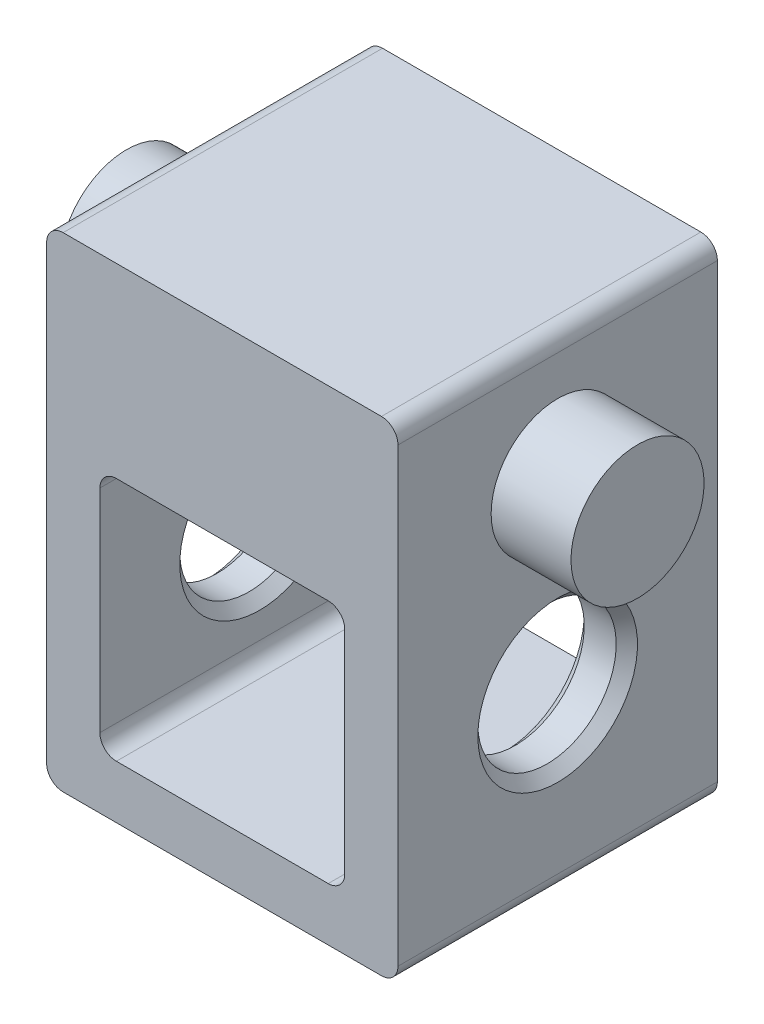
ISO-10303-21;
HEADER;
FILE_DESCRIPTION(('STEP AP214'),'2;1');
FILE_NAME('part.step','',(''),(''),'','','');
FILE_SCHEMA(('AUTOMOTIVE_DESIGN { 1 0 10303 214 1 1 1 1 }'));
ENDSEC;
DATA;
#1=APPLICATION_CONTEXT('core data for automotive mechanical design processes');
#2=APPLICATION_PROTOCOL_DEFINITION('international standard','automotive_design',2000,#1);
#3=PRODUCT_CONTEXT('',#1,'mechanical');
#4=PRODUCT('Part','Part','',(#3));
#5=PRODUCT_RELATED_PRODUCT_CATEGORY('part','',(#4));
#6=PRODUCT_DEFINITION_FORMATION('','',#4);
#7=PRODUCT_DEFINITION_CONTEXT('part definition',#1,'design');
#8=PRODUCT_DEFINITION('design','',#6,#7);
#9=PRODUCT_DEFINITION_SHAPE('','',#8);
#10=(LENGTH_UNIT() NAMED_UNIT(*) SI_UNIT(.MILLI.,.METRE.));
#11=(NAMED_UNIT(*) PLANE_ANGLE_UNIT() SI_UNIT($,.RADIAN.));
#12=(NAMED_UNIT(*) SI_UNIT($,.STERADIAN.) SOLID_ANGLE_UNIT());
#13=UNCERTAINTY_MEASURE_WITH_UNIT(LENGTH_MEASURE(1.E-05),#10,'distance_accuracy_value','');
#14=(GEOMETRIC_REPRESENTATION_CONTEXT(3) GLOBAL_UNCERTAINTY_ASSIGNED_CONTEXT((#13)) GLOBAL_UNIT_ASSIGNED_CONTEXT((#10,
#11,#12)) REPRESENTATION_CONTEXT('',''));
#15=CARTESIAN_POINT('',(0.,0.,0.));
#16=DIRECTION('',(0.,0.,1.));
#17=DIRECTION('',(1.,0.,0.));
#18=AXIS2_PLACEMENT_3D('',#15,#16,#17);
#19=CARTESIAN_POINT('',(-33.,23.,60.));
#20=DIRECTION('',(0.,-1.,0.));
#21=DIRECTION('',(0.,0.,-1.));
#22=AXIS2_PLACEMENT_3D('',#19,#20,#21);
#23=PLANE('',#22);
#24=DIRECTION('',(0.,0.,-1.));
#25=VECTOR('',#24,1.);
#26=CARTESIAN_POINT('',(-19.9,23.,0.));
#27=LINE('',#26,#25);
#28=CARTESIAN_POINT('',(-19.9,23.,60.));
#29=VERTEX_POINT('',#28);
#30=CARTESIAN_POINT('',(-19.9,23.,33.657597219348));
#31=VERTEX_POINT('',#30);
#32=EDGE_CURVE('E185',#29,#31,#27,.T.);
#33=ORIENTED_EDGE('',*,*,#32,.T.);
#34=DIRECTION('',(-1.,0.,0.));
#35=VECTOR('',#34,1.);
#36=CARTESIAN_POINT('',(98.3553390593274,23.,33.657597219348));
#37=LINE('',#36,#35);
#38=CARTESIAN_POINT('',(19.9,23.,33.657597219348));
#39=VERTEX_POINT('',#38);
#40=EDGE_CURVE('E62',#31,#39,#37,.F.);
#41=ORIENTED_EDGE('',*,*,#40,.T.);
#42=DIRECTION('',(0.,0.,-1.));
#43=VECTOR('',#42,1.);
#44=CARTESIAN_POINT('',(19.9,23.,60.));
#45=LINE('',#44,#43);
#46=CARTESIAN_POINT('',(19.9,23.,60.));
#47=VERTEX_POINT('',#46);
#48=EDGE_CURVE('E326',#39,#47,#45,.F.);
#49=ORIENTED_EDGE('',*,*,#48,.T.);
#50=DIRECTION('',(-1.,0.,0.));
#51=VECTOR('',#50,1.);
#52=CARTESIAN_POINT('',(0.,23.,60.));
#53=LINE('',#52,#51);
#54=EDGE_CURVE('E460',#47,#29,#53,.T.);
#55=ORIENTED_EDGE('',*,*,#54,.T.);
#56=EDGE_LOOP('',(#33,#41,#49,#55));
#57=FACE_BOUND('',#56,.T.);
#58=ADVANCED_FACE('F45',(#57),#23,.T.);
#59=CARTESIAN_POINT('',(19.9,23.,0.));
#60=VERTEX_POINT('',#59);
#61=CARTESIAN_POINT('',(19.9,23.,26.342402780652));
#62=VERTEX_POINT('',#61);
#63=EDGE_CURVE('E191',#60,#62,#45,.F.);
#64=ORIENTED_EDGE('',*,*,#63,.T.);
#65=DIRECTION('',(-1.,0.,0.));
#66=VECTOR('',#65,1.);
#67=CARTESIAN_POINT('',(98.3553390593274,23.,26.342402780652));
#68=LINE('',#67,#66);
#69=CARTESIAN_POINT('',(-19.9,23.,26.342402780652));
#70=VERTEX_POINT('',#69);
#71=EDGE_CURVE('E189',#62,#70,#68,.T.);
#72=ORIENTED_EDGE('',*,*,#71,.T.);
#73=CARTESIAN_POINT('',(-19.9,23.,0.));
#74=VERTEX_POINT('',#73);
#75=EDGE_CURVE('E173',#70,#74,#27,.T.);
#76=ORIENTED_EDGE('',*,*,#75,.T.);
#77=DIRECTION('',(-1.,0.,0.));
#78=VECTOR('',#77,1.);
#79=CARTESIAN_POINT('',(0.,23.,0.));
#80=LINE('',#79,#78);
#81=EDGE_CURVE('E304',#60,#74,#80,.T.);
#82=ORIENTED_EDGE('',*,*,#81,.F.);
#83=EDGE_LOOP('',(#64,#72,#76,#82));
#84=FACE_BOUND('',#83,.T.);
#85=ADVANCED_FACE('F190',(#84),#23,.T.);
#86=CARTESIAN_POINT('',(19.9,19.9,60.));
#87=DIRECTION('',(0.,0.,1.));
#88=DIRECTION('',(1.,0.,0.));
#89=AXIS2_PLACEMENT_3D('',#86,#87,#88);
#90=CYLINDRICAL_SURFACE('',#89,3.1);
#91=CARTESIAN_POINT('',(19.9,23.,26.342402780652));
#92=CARTESIAN_POINT('',(19.9285633628177,23.0000028304004,26.3423960344375));
#93=CARTESIAN_POINT('',(19.957109054343,22.9996048220393,26.3436940158008));
#94=CARTESIAN_POINT('',(20.0139228636187,22.9980357040034,26.3488266767273));
#95=CARTESIAN_POINT('',(20.0421912244072,22.9968653468766,26.3526588870387));
#96=CARTESIAN_POINT('',(20.1257054495445,22.9922701141015,26.3677442083655));
#97=CARTESIAN_POINT('',(20.1802758172521,22.9877597738986,26.3825894540667));
#98=CARTESIAN_POINT('',(20.2858702000714,22.9763500086851,26.4205492899373));
#99=CARTESIAN_POINT('',(20.3369060966944,22.9694591061972,26.4436343907043));
#100=CARTESIAN_POINT('',(20.4351332667615,22.9538683792828,26.4965955476452));
#101=CARTESIAN_POINT('',(20.4823139513785,22.9451637914421,26.5264895060716));
#102=CARTESIAN_POINT('',(20.6024448966748,22.9203403492811,26.6131905627068));
#103=CARTESIAN_POINT('',(20.6717579321131,22.903130228876,26.6747063930722));
#104=CARTESIAN_POINT('',(20.7998591558621,22.86727146628,26.8074806433875));
#105=CARTESIAN_POINT('',(20.8586177823106,22.8486189866814,26.8787654715963));
#106=CARTESIAN_POINT('',(20.9601073272684,22.813531279541,27.0183767873668));
#107=CARTESIAN_POINT('',(21.0039258390411,22.7971148374057,27.0859320538538));
#108=CARTESIAN_POINT('',(21.08555052395,22.7646815831608,27.2247076119028));
#109=CARTESIAN_POINT('',(21.1233520530069,22.748665087703,27.2959306788024));
#110=CARTESIAN_POINT('',(21.1937547476694,22.7173893907623,27.4411644667609));
#111=CARTESIAN_POINT('',(21.2263486235532,22.7021312710772,27.5151789192792));
#112=CARTESIAN_POINT('',(21.2869366476368,22.6726407453557,27.6652783411199));
#113=CARTESIAN_POINT('',(21.3149290748378,22.658408724205,27.7413640727811));
#114=CARTESIAN_POINT('',(21.3891141912606,22.6194734780576,27.9610289038693));
#115=CARTESIAN_POINT('',(21.4303408641616,22.5962512900921,28.1065589456122));
#116=CARTESIAN_POINT('',(21.5013355706795,22.5546928013239,28.4011024354214));
#117=CARTESIAN_POINT('',(21.5310941259335,22.5363605458704,28.5501186573814));
#118=CARTESIAN_POINT('',(21.5808149901938,22.5049425365711,28.8506295067954));
#119=CARTESIAN_POINT('',(21.6007565588225,22.491867901091,29.0021286886509));
#120=CARTESIAN_POINT('',(21.6317923766346,22.4712327004175,29.3064040333202));
#121=CARTESIAN_POINT('',(21.6428854282543,22.4636728816146,29.459180366158));
#122=CARTESIAN_POINT('',(21.6573392245917,22.4537901863914,29.7776142305403));
#123=CARTESIAN_POINT('',(21.660005135748,22.4519382104233,29.9433180574941));
#124=CARTESIAN_POINT('',(21.6558114874661,22.4548252930085,30.2745982819659));
#125=CARTESIAN_POINT('',(21.6489490537208,22.4595663404048,30.4401746259501));
#126=CARTESIAN_POINT('',(21.6253433622828,22.4755375729769,30.7696400136155));
#127=CARTESIAN_POINT('',(21.6086403149118,22.4867413465469,30.9335331777875));
#128=CARTESIAN_POINT('',(21.5644128802393,22.5154228306997,31.2592364759058));
#129=CARTESIAN_POINT('',(21.5368953443057,22.532896568426,31.4210478618348));
#130=CARTESIAN_POINT('',(21.4753465933576,22.5700795547278,31.7126515118092));
#131=CARTESIAN_POINT('',(21.4433594665163,22.5888306125015,31.8429962145307));
#132=CARTESIAN_POINT('',(21.3693132807894,22.6300071862314,32.1007607596988));
#133=CARTESIAN_POINT('',(21.3272213488743,22.652444617937,32.2281695367964));
#134=CARTESIAN_POINT('',(21.2480742987973,22.6917520296469,32.4332673157594));
#135=CARTESIAN_POINT('',(21.214570155619,22.7077564183335,32.5124936211399));
#136=CARTESIAN_POINT('',(21.1417350015315,22.7407216030432,32.6681173263649));
#137=CARTESIAN_POINT('',(21.1024002643883,22.7576830063529,32.7445128778062));
#138=CARTESIAN_POINT('',(21.0172233757908,22.7920427445066,32.8929491662859));
#139=CARTESIAN_POINT('',(20.9714179638651,22.8094381847915,32.9650114216157));
#140=CARTESIAN_POINT('',(20.8720994761172,22.8441108648964,33.1035681257225));
#141=CARTESIAN_POINT('',(20.8186002641734,22.8613882599912,33.1700722562704));
#142=CARTESIAN_POINT('',(20.7156089566864,22.8911492330612,33.2812414986729));
#143=CARTESIAN_POINT('',(20.6678809403072,22.903843054601,33.327470628519));
#144=CARTESIAN_POINT('',(20.5665351987159,22.9279436089814,33.4135397256682));
#145=CARTESIAN_POINT('',(20.5129143709424,22.9393496573415,33.453376299879));
#146=CARTESIAN_POINT('',(20.3989936670945,22.9601307341181,33.5248727445681));
#147=CARTESIAN_POINT('',(20.3386153915263,22.9694771520166,33.5564184788032));
#148=CARTESIAN_POINT('',(20.2127229129681,22.9848295593134,33.6077500812544));
#149=CARTESIAN_POINT('',(20.1472295283206,22.9908483583651,33.6275810658339));
#150=CARTESIAN_POINT('',(20.0506973053368,22.9964790301174,33.6460752528892));
#151=CARTESIAN_POINT('',(20.0207717412515,22.9977923481442,33.6503767193019));
#152=CARTESIAN_POINT('',(19.9605724403983,22.99955501159,33.6561433536549));
#153=CARTESIAN_POINT('',(19.9302981936676,23.0000028683745,33.6576036346505));
#154=CARTESIAN_POINT('',(19.9,23.,33.657597219348));
#155=B_SPLINE_CURVE_WITH_KNOTS('',3,(#91,#92,#93,#94,#95,#96,#97,#98,#99,#100,#101,#102,#103,
#104,#105,#106,#107,#108,#109,#110,#111,#112,#113,#114,#115,#116,#117,#118,#119,#120,#121,#122,
#123,#124,#125,#126,#127,#128,#129,#130,#131,#132,#133,#134,#135,#136,#137,#138,#139,#140,#141,
#142,#143,#144,#145,#146,#147,#148,#149,#150,#151,#152,#153,#154),.UNSPECIFIED.,.F.,.F.,(4,2,2,
2,2,2,2,2,2,2,2,2,2,2,2,2,2,2,2,2,2,2,2,2,2,2,2,2,2,2,2,4),(0.,0.0856249215497008,
0.17116653627168,0.340432030123836,0.509097720025095,0.678212102448673,0.959372458101905,
1.24130843703037,1.48749112832188,1.73386291861116,1.98057661679785,2.2273823800429,
2.685739055993,3.14447375394633,3.60417350670773,4.06393546496148,4.56073227120504,
5.05767897304498,5.55260901856762,6.04722601224249,6.45341389143928,6.86094153130391,
7.12323386500792,7.38569455384445,7.64672082959111,7.90728250818762,8.10977564413795,
8.31237590803035,8.51763430156458,8.72209695232146,8.81275254921314,8.90356393974021),.UNSPECIFIED.);
#156=EDGE_CURVE('E69',#62,#39,#155,.T.);
#157=ORIENTED_EDGE('',*,*,#156,.F.);
#158=ORIENTED_EDGE('',*,*,#63,.F.);
#159=CARTESIAN_POINT('',(19.9,19.9,0.));
#160=DIRECTION('',(0.,0.,-1.));
#161=DIRECTION('',(-1.,0.,0.));
#162=AXIS2_PLACEMENT_3D('',#159,#160,#161);
#163=CIRCLE('',#162,3.1);
#164=CARTESIAN_POINT('',(23.,19.9,0.));
#165=VERTEX_POINT('',#164);
#166=EDGE_CURVE('E339',#165,#60,#163,.F.);
#167=ORIENTED_EDGE('',*,*,#166,.F.);
#168=DIRECTION('',(0.,0.,-1.));
#169=VECTOR('',#168,1.);
#170=CARTESIAN_POINT('',(23.,19.9,0.));
#171=LINE('',#170,#169);
#172=CARTESIAN_POINT('',(23.,19.9,60.));
#173=VERTEX_POINT('',#172);
#174=EDGE_CURVE('E301',#173,#165,#171,.T.);
#175=ORIENTED_EDGE('',*,*,#174,.F.);
#176=CARTESIAN_POINT('',(19.9,19.9,60.));
#177=DIRECTION('',(0.,0.,-1.));
#178=DIRECTION('',(-1.,0.,0.));
#179=AXIS2_PLACEMENT_3D('',#176,#177,#178);
#180=CIRCLE('',#179,3.1);
#181=EDGE_CURVE('E342',#47,#173,#180,.T.);
#182=ORIENTED_EDGE('',*,*,#181,.F.);
#183=ORIENTED_EDGE('',*,*,#48,.F.);
#184=EDGE_LOOP('',(#157,#158,#167,#175,#182,#183));
#185=FACE_BOUND('',#184,.T.);
#186=ADVANCED_FACE('F242',(#185),#90,.F.);
#187=CARTESIAN_POINT('',(-19.9,19.9,60.));
#188=DIRECTION('',(0.,0.,1.));
#189=DIRECTION('',(1.,0.,0.));
#190=AXIS2_PLACEMENT_3D('',#187,#188,#189);
#191=CYLINDRICAL_SURFACE('',#190,3.1);
#192=CARTESIAN_POINT('',(-19.9,23.,33.657597219348));
#193=CARTESIAN_POINT('',(-19.9285633628177,23.0000028304004,33.6576039655625));
#194=CARTESIAN_POINT('',(-19.957109054343,22.9996048220393,33.6563059841992));
#195=CARTESIAN_POINT('',(-20.0139228636187,22.9980357040034,33.6511733232727));
#196=CARTESIAN_POINT('',(-20.0421912244072,22.9968653468766,33.6473411129613));
#197=CARTESIAN_POINT('',(-20.1257054495445,22.9922701141015,33.6322557916345));
#198=CARTESIAN_POINT('',(-20.1802758172521,22.9877597738986,33.6174105459333));
#199=CARTESIAN_POINT('',(-20.2858702000714,22.9763500086851,33.5794507100627));
#200=CARTESIAN_POINT('',(-20.3369060966944,22.9694591061972,33.5563656092957));
#201=CARTESIAN_POINT('',(-20.4351332667615,22.9538683792828,33.5034044523548));
#202=CARTESIAN_POINT('',(-20.4823139513786,22.9451637914421,33.4735104939284));
#203=CARTESIAN_POINT('',(-20.6024448966748,22.9203403492811,33.3868094372932));
#204=CARTESIAN_POINT('',(-20.6717579321131,22.903130228876,33.3252936069278));
#205=CARTESIAN_POINT('',(-20.7998591558621,22.86727146628,33.1925193566124));
#206=CARTESIAN_POINT('',(-20.8586177823106,22.8486189866813,33.1212345284037));
#207=CARTESIAN_POINT('',(-20.9601073272684,22.813531279541,32.9816232126332));
#208=CARTESIAN_POINT('',(-21.0039258390411,22.7971148374057,32.9140679461462));
#209=CARTESIAN_POINT('',(-21.08555052395,22.7646815831608,32.7752923880972));
#210=CARTESIAN_POINT('',(-21.1233520530069,22.748665087703,32.7040693211976));
#211=CARTESIAN_POINT('',(-21.1937547476694,22.7173893907623,32.558835533239));
#212=CARTESIAN_POINT('',(-21.2263486235532,22.7021312710772,32.4848210807208));
#213=CARTESIAN_POINT('',(-21.2869366476368,22.6726407453557,32.3347216588801));
#214=CARTESIAN_POINT('',(-21.3149290748378,22.658408724205,32.2586359272189));
#215=CARTESIAN_POINT('',(-21.3891141912606,22.6194734780576,32.0389710961307));
#216=CARTESIAN_POINT('',(-21.4303408641616,22.5962512900921,31.8934410543877));
#217=CARTESIAN_POINT('',(-21.5013355706795,22.5546928013239,31.5988975645785));
#218=CARTESIAN_POINT('',(-21.5310941259335,22.5363605458704,31.4498813426186));
#219=CARTESIAN_POINT('',(-21.5808149901938,22.5049425365711,31.1493704932045));
#220=CARTESIAN_POINT('',(-21.6007565588225,22.491867901091,30.9978713113491));
#221=CARTESIAN_POINT('',(-21.6317923766346,22.4712327004175,30.6935959666798));
#222=CARTESIAN_POINT('',(-21.6428854282543,22.4636728816146,30.5408196338419));
#223=CARTESIAN_POINT('',(-21.6573392245917,22.4537901863914,30.2223857694597));
#224=CARTESIAN_POINT('',(-21.660005135748,22.4519382104232,30.0566819425058));
#225=CARTESIAN_POINT('',(-21.6558114874661,22.4548252930085,29.725401718034));
#226=CARTESIAN_POINT('',(-21.6489490537207,22.4595663404048,29.5598253740498));
#227=CARTESIAN_POINT('',(-21.6253433622828,22.4755375729769,29.2303599863844));
#228=CARTESIAN_POINT('',(-21.6086403149118,22.4867413465469,29.0664668222124));
#229=CARTESIAN_POINT('',(-21.5644128802393,22.5154228306997,28.7407635240941));
#230=CARTESIAN_POINT('',(-21.5368953443057,22.532896568426,28.5789521381651));
#231=CARTESIAN_POINT('',(-21.4753465933576,22.5700795547278,28.2873484881907));
#232=CARTESIAN_POINT('',(-21.4433594665163,22.5888306125015,28.1570037854692));
#233=CARTESIAN_POINT('',(-21.3693132807894,22.6300071862314,27.8992392403011));
#234=CARTESIAN_POINT('',(-21.3272213488743,22.652444617937,27.7718304632035));
#235=CARTESIAN_POINT('',(-21.2480742987972,22.6917520296469,27.5667326842405));
#236=CARTESIAN_POINT('',(-21.214570155619,22.7077564183335,27.4875063788601));
#237=CARTESIAN_POINT('',(-21.1417350015315,22.7407216030432,27.3318826736351));
#238=CARTESIAN_POINT('',(-21.1024002643883,22.7576830063529,27.2554871221938));
#239=CARTESIAN_POINT('',(-21.0172233757908,22.7920427445066,27.1070508337141));
#240=CARTESIAN_POINT('',(-20.9714179638651,22.8094381847915,27.0349885783843));
#241=CARTESIAN_POINT('',(-20.8720994761172,22.8441108648964,26.8964318742775));
#242=CARTESIAN_POINT('',(-20.8186002641734,22.8613882599912,26.8299277437296));
#243=CARTESIAN_POINT('',(-20.7156089566864,22.8911492330612,26.7187585013271));
#244=CARTESIAN_POINT('',(-20.6678809403072,22.903843054601,26.672529371481));
#245=CARTESIAN_POINT('',(-20.5665351987158,22.9279436089814,26.5864602743318));
#246=CARTESIAN_POINT('',(-20.5129143709424,22.9393496573415,26.546623700121));
#247=CARTESIAN_POINT('',(-20.3989936670945,22.9601307341181,26.4751272554319));
#248=CARTESIAN_POINT('',(-20.3386153915263,22.9694771520166,26.4435815211968));
#249=CARTESIAN_POINT('',(-20.2127229129681,22.9848295593134,26.3922499187456));
#250=CARTESIAN_POINT('',(-20.1472295283205,22.9908483583651,26.3724189341661));
#251=CARTESIAN_POINT('',(-20.0506973053368,22.9964790301174,26.3539247471107));
#252=CARTESIAN_POINT('',(-20.0207717412515,22.9977923481442,26.3496232806981));
#253=CARTESIAN_POINT('',(-19.9605724403983,22.99955501159,26.3438566463451));
#254=CARTESIAN_POINT('',(-19.9302981936676,23.0000028683745,26.3423963653495));
#255=CARTESIAN_POINT('',(-19.9,23.,26.342402780652));
#256=B_SPLINE_CURVE_WITH_KNOTS('',3,(#192,#193,#194,#195,#196,#197,#198,#199,#200,#201,#202,
#203,#204,#205,#206,#207,#208,#209,#210,#211,#212,#213,#214,#215,#216,#217,#218,#219,#220,#221,
#222,#223,#224,#225,#226,#227,#228,#229,#230,#231,#232,#233,#234,#235,#236,#237,#238,#239,#240,
#241,#242,#243,#244,#245,#246,#247,#248,#249,#250,#251,#252,#253,#254,#255),.UNSPECIFIED.,.F.,
.F.,(4,2,2,2,2,2,2,2,2,2,2,2,2,2,2,2,2,2,2,2,2,2,2,2,2,2,2,2,2,2,2,4),(0.,0.0856249215497006,
0.17116653627168,0.340432030123838,0.509097720025102,0.67821210244868,0.959372458101917,
1.24130843703038,1.48749112832189,1.73386291861119,1.98057661679788,2.22738238004294,
2.68573905599305,3.14447375394638,3.60417350670778,4.06393546496155,4.56073227120511,
5.05767897304507,5.5526090185677,6.04722601224258,6.45341389143936,6.86094153130399,
7.12323386500798,7.3856945538445,7.64672082959114,7.90728250818765,8.10977564413798,
8.31237590803037,8.5176343015646,8.72209695232148,8.81275254921315,8.90356393974021),.UNSPECIFIED.);
#257=EDGE_CURVE('E178',#31,#70,#256,.T.);
#258=ORIENTED_EDGE('',*,*,#257,.F.);
#259=ORIENTED_EDGE('',*,*,#32,.F.);
#260=CARTESIAN_POINT('',(-19.9,19.9,60.));
#261=DIRECTION('',(0.,0.,-1.));
#262=DIRECTION('',(-1.,0.,0.));
#263=AXIS2_PLACEMENT_3D('',#260,#261,#262);
#264=CIRCLE('',#263,3.1);
#265=CARTESIAN_POINT('',(-23.,19.9,60.));
#266=VERTEX_POINT('',#265);
#267=EDGE_CURVE('E347',#266,#29,#264,.T.);
#268=ORIENTED_EDGE('',*,*,#267,.F.);
#269=DIRECTION('',(0.,0.,-1.));
#270=VECTOR('',#269,1.);
#271=CARTESIAN_POINT('',(-23.,19.9,60.));
#272=LINE('',#271,#270);
#273=CARTESIAN_POINT('',(-23.,19.9,0.));
#274=VERTEX_POINT('',#273);
#275=EDGE_CURVE('E313',#274,#266,#272,.F.);
#276=ORIENTED_EDGE('',*,*,#275,.F.);
#277=CARTESIAN_POINT('',(-19.9,19.9,0.));
#278=DIRECTION('',(0.,0.,-1.));
#279=DIRECTION('',(-1.,0.,0.));
#280=AXIS2_PLACEMENT_3D('',#277,#278,#279);
#281=CIRCLE('',#280,3.1);
#282=EDGE_CURVE('E180',#74,#274,#281,.F.);
#283=ORIENTED_EDGE('',*,*,#282,.F.);
#284=ORIENTED_EDGE('',*,*,#75,.F.);
#285=EDGE_LOOP('',(#258,#259,#268,#276,#283,#284));
#286=FACE_BOUND('',#285,.T.);
#287=ADVANCED_FACE('F175',(#286),#191,.F.);
#288=CARTESIAN_POINT('',(0.,0.,60.));
#289=DIRECTION('',(0.,0.,-1.));
#290=DIRECTION('',(-1.,0.,0.));
#291=AXIS2_PLACEMENT_3D('',#288,#289,#290);
#292=PLANE('',#291);
#293=DIRECTION('',(1.,0.,0.));
#294=VECTOR('',#293,1.);
#295=CARTESIAN_POINT('',(-33.,-33.,60.));
#296=LINE('',#295,#294);
#297=CARTESIAN_POINT('',(-29.9,-33.,60.));
#298=VERTEX_POINT('',#297);
#299=CARTESIAN_POINT('',(29.9,-33.,60.));
#300=VERTEX_POINT('',#299);
#301=EDGE_CURVE('E428',#298,#300,#296,.T.);
#302=ORIENTED_EDGE('',*,*,#301,.T.);
#303=CARTESIAN_POINT('',(29.9,-29.9,60.));
#304=DIRECTION('',(0.,0.,-1.));
#305=DIRECTION('',(-1.,0.,0.));
#306=AXIS2_PLACEMENT_3D('',#303,#304,#305);
#307=CIRCLE('',#306,3.1);
#308=CARTESIAN_POINT('',(33.,-29.9,60.));
#309=VERTEX_POINT('',#308);
#310=EDGE_CURVE('E386',#300,#309,#307,.F.);
#311=ORIENTED_EDGE('',*,*,#310,.T.);
#312=DIRECTION('',(0.,1.,0.));
#313=VECTOR('',#312,1.);
#314=CARTESIAN_POINT('',(33.,-33.,60.));
#315=LINE('',#314,#313);
#316=CARTESIAN_POINT('',(33.,54.9,60.));
#317=VERTEX_POINT('',#316);
#318=EDGE_CURVE('E415',#309,#317,#315,.T.);
#319=ORIENTED_EDGE('',*,*,#318,.T.);
#320=CARTESIAN_POINT('',(29.9,54.9,60.));
#321=DIRECTION('',(0.,0.,-1.));
#322=DIRECTION('',(-1.,0.,0.));
#323=AXIS2_PLACEMENT_3D('',#320,#321,#322);
#324=CIRCLE('',#323,3.1);
#325=CARTESIAN_POINT('',(29.9,58.,60.));
#326=VERTEX_POINT('',#325);
#327=EDGE_CURVE('E377',#317,#326,#324,.F.);
#328=ORIENTED_EDGE('',*,*,#327,.T.);
#329=DIRECTION('',(1.,0.,0.));
#330=VECTOR('',#329,1.);
#331=CARTESIAN_POINT('',(-98.,58.,60.));
#332=LINE('',#331,#330);
#333=CARTESIAN_POINT('',(-29.9,58.,60.));
#334=VERTEX_POINT('',#333);
#335=EDGE_CURVE('E305',#334,#326,#332,.T.);
#336=ORIENTED_EDGE('',*,*,#335,.F.);
#337=CARTESIAN_POINT('',(-29.9,54.9,60.));
#338=DIRECTION('',(0.,0.,-1.));
#339=DIRECTION('',(-1.,0.,0.));
#340=AXIS2_PLACEMENT_3D('',#337,#338,#339);
#341=CIRCLE('',#340,3.1);
#342=CARTESIAN_POINT('',(-33.,54.9,60.));
#343=VERTEX_POINT('',#342);
#344=EDGE_CURVE('E380',#334,#343,#341,.F.);
#345=ORIENTED_EDGE('',*,*,#344,.T.);
#346=DIRECTION('',(0.,-1.,0.));
#347=VECTOR('',#346,1.);
#348=CARTESIAN_POINT('',(-33.,-33.,60.));
#349=LINE('',#348,#347);
#350=CARTESIAN_POINT('',(-33.,-29.9,60.));
#351=VERTEX_POINT('',#350);
#352=EDGE_CURVE('E422',#343,#351,#349,.T.);
#353=ORIENTED_EDGE('',*,*,#352,.T.);
#354=CARTESIAN_POINT('',(-29.9,-29.9,60.));
#355=DIRECTION('',(0.,0.,-1.));
#356=DIRECTION('',(-1.,0.,0.));
#357=AXIS2_PLACEMENT_3D('',#354,#355,#356);
#358=CIRCLE('',#357,3.1);
#359=EDGE_CURVE('E383',#351,#298,#358,.F.);
#360=ORIENTED_EDGE('',*,*,#359,.T.);
#361=EDGE_LOOP('',(#302,#311,#319,#328,#336,#345,#353,#360));
#362=FACE_BOUND('',#361,.T.);
#363=DIRECTION('',(0.,1.,0.));
#364=VECTOR('',#363,1.);
#365=CARTESIAN_POINT('',(23.,0.,60.));
#366=LINE('',#365,#364);
#367=CARTESIAN_POINT('',(23.,-19.9,60.));
#368=VERTEX_POINT('',#367);
#369=EDGE_CURVE('E455',#368,#173,#366,.T.);
#370=ORIENTED_EDGE('',*,*,#369,.F.);
#371=CARTESIAN_POINT('',(19.9,-19.9,60.));
#372=DIRECTION('',(0.,0.,-1.));
#373=DIRECTION('',(-1.,0.,0.));
#374=AXIS2_PLACEMENT_3D('',#371,#372,#373);
#375=CIRCLE('',#374,3.1);
#376=CARTESIAN_POINT('',(19.9,-23.,60.));
#377=VERTEX_POINT('',#376);
#378=EDGE_CURVE('E311',#368,#377,#375,.T.);
#379=ORIENTED_EDGE('',*,*,#378,.T.);
#380=DIRECTION('',(1.,0.,0.));
#381=VECTOR('',#380,1.);
#382=CARTESIAN_POINT('',(0.,-23.,60.));
#383=LINE('',#382,#381);
#384=CARTESIAN_POINT('',(-19.9,-23.,60.));
#385=VERTEX_POINT('',#384);
#386=EDGE_CURVE('E434',#385,#377,#383,.T.);
#387=ORIENTED_EDGE('',*,*,#386,.F.);
#388=CARTESIAN_POINT('',(-19.9,-19.9,60.));
#389=DIRECTION('',(0.,0.,-1.));
#390=DIRECTION('',(-1.,0.,0.));
#391=AXIS2_PLACEMENT_3D('',#388,#389,#390);
#392=CIRCLE('',#391,3.1);
#393=CARTESIAN_POINT('',(-23.,-19.9,60.));
#394=VERTEX_POINT('',#393);
#395=EDGE_CURVE('E336',#385,#394,#392,.T.);
#396=ORIENTED_EDGE('',*,*,#395,.T.);
#397=DIRECTION('',(0.,-1.,0.));
#398=VECTOR('',#397,1.);
#399=CARTESIAN_POINT('',(-23.,0.,60.));
#400=LINE('',#399,#398);
#401=EDGE_CURVE('E468',#266,#394,#400,.T.);
#402=ORIENTED_EDGE('',*,*,#401,.F.);
#403=ORIENTED_EDGE('',*,*,#267,.T.);
#404=ORIENTED_EDGE('',*,*,#54,.F.);
#405=ORIENTED_EDGE('',*,*,#181,.T.);
#406=EDGE_LOOP('',(#370,#379,#387,#396,#402,#403,#404,#405));
#407=FACE_BOUND('',#406,.T.);
#408=ADVANCED_FACE('F271',(#362,#407),#292,.F.);
#409=CARTESIAN_POINT('',(0.,0.,0.));
#410=DIRECTION('',(0.,0.,-1.));
#411=DIRECTION('',(-1.,0.,0.));
#412=AXIS2_PLACEMENT_3D('',#409,#410,#411);
#413=PLANE('',#412);
#414=DIRECTION('',(0.,1.,0.));
#415=VECTOR('',#414,1.);
#416=CARTESIAN_POINT('',(33.,-33.,0.));
#417=LINE('',#416,#415);
#418=CARTESIAN_POINT('',(33.,-29.9,0.));
#419=VERTEX_POINT('',#418);
#420=CARTESIAN_POINT('',(33.,54.9,0.));
#421=VERTEX_POINT('',#420);
#422=EDGE_CURVE('E417',#419,#421,#417,.T.);
#423=ORIENTED_EDGE('',*,*,#422,.F.);
#424=CARTESIAN_POINT('',(29.9,-29.9,0.));
#425=DIRECTION('',(0.,0.,-1.));
#426=DIRECTION('',(-1.,0.,0.));
#427=AXIS2_PLACEMENT_3D('',#424,#425,#426);
#428=CIRCLE('',#427,3.1);
#429=CARTESIAN_POINT('',(29.9,-33.,0.));
#430=VERTEX_POINT('',#429);
#431=EDGE_CURVE('E367',#419,#430,#428,.T.);
#432=ORIENTED_EDGE('',*,*,#431,.T.);
#433=DIRECTION('',(1.,0.,0.));
#434=VECTOR('',#433,1.);
#435=CARTESIAN_POINT('',(-33.,-33.,0.));
#436=LINE('',#435,#434);
#437=CARTESIAN_POINT('',(-29.9,-33.,0.));
#438=VERTEX_POINT('',#437);
#439=EDGE_CURVE('E423',#438,#430,#436,.T.);
#440=ORIENTED_EDGE('',*,*,#439,.F.);
#441=CARTESIAN_POINT('',(-29.9,-29.9,0.));
#442=DIRECTION('',(0.,0.,-1.));
#443=DIRECTION('',(-1.,0.,0.));
#444=AXIS2_PLACEMENT_3D('',#441,#442,#443);
#445=CIRCLE('',#444,3.1);
#446=CARTESIAN_POINT('',(-33.,-29.9,0.));
#447=VERTEX_POINT('',#446);
#448=EDGE_CURVE('E364',#438,#447,#445,.T.);
#449=ORIENTED_EDGE('',*,*,#448,.T.);
#450=DIRECTION('',(0.,-1.,0.));
#451=VECTOR('',#450,1.);
#452=CARTESIAN_POINT('',(-33.,-33.,0.));
#453=LINE('',#452,#451);
#454=CARTESIAN_POINT('',(-33.,54.9,0.));
#455=VERTEX_POINT('',#454);
#456=EDGE_CURVE('E431',#455,#447,#453,.T.);
#457=ORIENTED_EDGE('',*,*,#456,.F.);
#458=CARTESIAN_POINT('',(-29.9,54.9,0.));
#459=DIRECTION('',(0.,0.,-1.));
#460=DIRECTION('',(-1.,0.,0.));
#461=AXIS2_PLACEMENT_3D('',#458,#459,#460);
#462=CIRCLE('',#461,3.1);
#463=CARTESIAN_POINT('',(-29.9,58.,0.));
#464=VERTEX_POINT('',#463);
#465=EDGE_CURVE('E361',#455,#464,#462,.T.);
#466=ORIENTED_EDGE('',*,*,#465,.T.);
#467=DIRECTION('',(1.,0.,0.));
#468=VECTOR('',#467,1.);
#469=CARTESIAN_POINT('',(-98.,58.,0.));
#470=LINE('',#469,#468);
#471=CARTESIAN_POINT('',(29.9,58.,0.));
#472=VERTEX_POINT('',#471);
#473=EDGE_CURVE('E240',#464,#472,#470,.T.);
#474=ORIENTED_EDGE('',*,*,#473,.T.);
#475=CARTESIAN_POINT('',(29.9,54.9,0.));
#476=DIRECTION('',(0.,0.,-1.));
#477=DIRECTION('',(-1.,0.,0.));
#478=AXIS2_PLACEMENT_3D('',#475,#476,#477);
#479=CIRCLE('',#478,3.1);
#480=EDGE_CURVE('E358',#472,#421,#479,.T.);
#481=ORIENTED_EDGE('',*,*,#480,.T.);
#482=EDGE_LOOP('',(#423,#432,#440,#449,#457,#466,#474,#481));
#483=FACE_BOUND('',#482,.T.);
#484=DIRECTION('',(0.,-1.,0.));
#485=VECTOR('',#484,1.);
#486=CARTESIAN_POINT('',(-23.,0.,0.));
#487=LINE('',#486,#485);
#488=CARTESIAN_POINT('',(-23.,-19.9,0.));
#489=VERTEX_POINT('',#488);
#490=EDGE_CURVE('E456',#274,#489,#487,.T.);
#491=ORIENTED_EDGE('',*,*,#490,.T.);
#492=CARTESIAN_POINT('',(-19.9,-19.9,0.));
#493=DIRECTION('',(0.,0.,-1.));
#494=DIRECTION('',(-1.,0.,0.));
#495=AXIS2_PLACEMENT_3D('',#492,#493,#494);
#496=CIRCLE('',#495,3.1);
#497=CARTESIAN_POINT('',(-19.9,-23.,0.));
#498=VERTEX_POINT('',#497);
#499=EDGE_CURVE('E333',#489,#498,#496,.F.);
#500=ORIENTED_EDGE('',*,*,#499,.T.);
#501=DIRECTION('',(1.,0.,0.));
#502=VECTOR('',#501,1.);
#503=CARTESIAN_POINT('',(0.,-23.,0.));
#504=LINE('',#503,#502);
#505=CARTESIAN_POINT('',(19.9,-23.,0.));
#506=VERTEX_POINT('',#505);
#507=EDGE_CURVE('E450',#498,#506,#504,.T.);
#508=ORIENTED_EDGE('',*,*,#507,.T.);
#509=CARTESIAN_POINT('',(19.9,-19.9,0.));
#510=DIRECTION('',(0.,0.,-1.));
#511=DIRECTION('',(-1.,0.,0.));
#512=AXIS2_PLACEMENT_3D('',#509,#510,#511);
#513=CIRCLE('',#512,3.1);
#514=CARTESIAN_POINT('',(23.,-19.9,0.));
#515=VERTEX_POINT('',#514);
#516=EDGE_CURVE('E309',#506,#515,#513,.F.);
#517=ORIENTED_EDGE('',*,*,#516,.T.);
#518=DIRECTION('',(0.,1.,0.));
#519=VECTOR('',#518,1.);
#520=CARTESIAN_POINT('',(23.,0.,0.));
#521=LINE('',#520,#519);
#522=EDGE_CURVE('E295',#515,#165,#521,.T.);
#523=ORIENTED_EDGE('',*,*,#522,.T.);
#524=ORIENTED_EDGE('',*,*,#166,.T.);
#525=ORIENTED_EDGE('',*,*,#81,.T.);
#526=ORIENTED_EDGE('',*,*,#282,.T.);
#527=EDGE_LOOP('',(#491,#500,#508,#517,#523,#524,#525,#526));
#528=FACE_BOUND('',#527,.T.);
#529=ADVANCED_FACE('F259',(#483,#528),#413,.T.);
#530=CARTESIAN_POINT('',(33.,-33.,60.));
#531=DIRECTION('',(-1.,0.,0.));
#532=DIRECTION('',(0.,0.,1.));
#533=AXIS2_PLACEMENT_3D('',#530,#531,#532);
#534=PLANE('',#533);
#535=CARTESIAN_POINT('',(33.,0.,30.));
#536=DIRECTION('',(-1.,0.,0.));
#537=DIRECTION('',(0.,0.,1.));
#538=AXIS2_PLACEMENT_3D('',#535,#536,#537);
#539=CIRCLE('',#538,15.);
#540=CARTESIAN_POINT('',(33.,0.,45.));
#541=VERTEX_POINT('',#540);
#542=EDGE_CURVE('E13',#541,#541,#539,.T.);
#543=ORIENTED_EDGE('',*,*,#542,.T.);
#544=EDGE_LOOP('',(#543));
#545=FACE_BOUND('',#544,.T.);
#546=CARTESIAN_POINT('',(33.,34.9529068674117,30.));
#547=DIRECTION('',(-1.,0.,0.));
#548=DIRECTION('',(0.,0.,1.));
#549=AXIS2_PLACEMENT_3D('',#546,#547,#548);
#550=CIRCLE('',#549,12.5);
#551=CARTESIAN_POINT('',(33.,34.9529068674117,42.5));
#552=VERTEX_POINT('',#551);
#553=EDGE_CURVE('E204',#552,#552,#550,.F.);
#554=ORIENTED_EDGE('',*,*,#553,.F.);
#555=EDGE_LOOP('',(#554));
#556=FACE_BOUND('',#555,.T.);
#557=ORIENTED_EDGE('',*,*,#318,.F.);
#558=DIRECTION('',(0.,0.,-1.));
#559=VECTOR('',#558,1.);
#560=CARTESIAN_POINT('',(33.,-29.9,60.));
#561=LINE('',#560,#559);
#562=EDGE_CURVE('E354',#309,#419,#561,.T.);
#563=ORIENTED_EDGE('',*,*,#562,.T.);
#564=ORIENTED_EDGE('',*,*,#422,.T.);
#565=DIRECTION('',(0.,0.,1.));
#566=VECTOR('',#565,1.);
#567=CARTESIAN_POINT('',(33.,54.9,60.));
#568=LINE('',#567,#566);
#569=EDGE_CURVE('E350',#421,#317,#568,.T.);
#570=ORIENTED_EDGE('',*,*,#569,.T.);
#571=EDGE_LOOP('',(#557,#563,#564,#570));
#572=FACE_BOUND('',#571,.T.);
#573=ADVANCED_FACE('F255',(#545,#556,#572),#534,.F.);
#574=CARTESIAN_POINT('',(-33.,-33.,60.));
#575=DIRECTION('',(1.,0.,0.));
#576=DIRECTION('',(0.,0.,-1.));
#577=AXIS2_PLACEMENT_3D('',#574,#575,#576);
#578=PLANE('',#577);
#579=CARTESIAN_POINT('',(-33.,0.,30.));
#580=DIRECTION('',(1.,0.,0.));
#581=DIRECTION('',(0.,0.,-1.));
#582=AXIS2_PLACEMENT_3D('',#579,#580,#581);
#583=CIRCLE('',#582,15.);
#584=CARTESIAN_POINT('',(-33.,0.,15.));
#585=VERTEX_POINT('',#584);
#586=EDGE_CURVE('E55',#585,#585,#583,.T.);
#587=ORIENTED_EDGE('',*,*,#586,.T.);
#588=EDGE_LOOP('',(#587));
#589=FACE_BOUND('',#588,.T.);
#590=CARTESIAN_POINT('',(-33.,34.9529068674117,30.));
#591=DIRECTION('',(1.,0.,0.));
#592=DIRECTION('',(0.,0.,-1.));
#593=AXIS2_PLACEMENT_3D('',#590,#591,#592);
#594=CIRCLE('',#593,12.5);
#595=CARTESIAN_POINT('',(-33.,34.9529068674117,17.5));
#596=VERTEX_POINT('',#595);
#597=EDGE_CURVE('E198',#596,#596,#594,.F.);
#598=ORIENTED_EDGE('',*,*,#597,.F.);
#599=EDGE_LOOP('',(#598));
#600=FACE_BOUND('',#599,.T.);
#601=ORIENTED_EDGE('',*,*,#456,.T.);
#602=DIRECTION('',(0.,0.,-1.));
#603=VECTOR('',#602,1.);
#604=CARTESIAN_POINT('',(-33.,-29.9,60.));
#605=LINE('',#604,#603);
#606=EDGE_CURVE('E393',#447,#351,#605,.F.);
#607=ORIENTED_EDGE('',*,*,#606,.T.);
#608=ORIENTED_EDGE('',*,*,#352,.F.);
#609=DIRECTION('',(0.,0.,-1.));
#610=VECTOR('',#609,1.);
#611=CARTESIAN_POINT('',(-33.,54.9,0.));
#612=LINE('',#611,#610);
#613=EDGE_CURVE('E389',#343,#455,#612,.T.);
#614=ORIENTED_EDGE('',*,*,#613,.T.);
#615=EDGE_LOOP('',(#601,#607,#608,#614));
#616=FACE_BOUND('',#615,.T.);
#617=ADVANCED_FACE('F258',(#589,#600,#616),#578,.F.);
#618=CARTESIAN_POINT('',(-33.,-33.,60.));
#619=DIRECTION('',(0.,1.,0.));
#620=DIRECTION('',(0.,0.,1.));
#621=AXIS2_PLACEMENT_3D('',#618,#619,#620);
#622=PLANE('',#621);
#623=ORIENTED_EDGE('',*,*,#439,.T.);
#624=DIRECTION('',(0.,0.,-1.));
#625=VECTOR('',#624,1.);
#626=CARTESIAN_POINT('',(29.9,-33.,60.));
#627=LINE('',#626,#625);
#628=EDGE_CURVE('E374',#430,#300,#627,.F.);
#629=ORIENTED_EDGE('',*,*,#628,.T.);
#630=ORIENTED_EDGE('',*,*,#301,.F.);
#631=DIRECTION('',(0.,0.,-1.));
#632=VECTOR('',#631,1.);
#633=CARTESIAN_POINT('',(-29.9,-33.,60.));
#634=LINE('',#633,#632);
#635=EDGE_CURVE('E370',#298,#438,#634,.T.);
#636=ORIENTED_EDGE('',*,*,#635,.T.);
#637=EDGE_LOOP('',(#623,#629,#630,#636));
#638=FACE_BOUND('',#637,.T.);
#639=ADVANCED_FACE('F263',(#638),#622,.F.);
#640=CARTESIAN_POINT('',(23.,-33.,60.));
#641=DIRECTION('',(-1.,0.,0.));
#642=DIRECTION('',(0.,0.,1.));
#643=AXIS2_PLACEMENT_3D('',#640,#641,#642);
#644=PLANE('',#643);
#645=CARTESIAN_POINT('',(23.,0.,30.));
#646=DIRECTION('',(-1.,0.,0.));
#647=DIRECTION('',(0.,0.,1.));
#648=AXIS2_PLACEMENT_3D('',#645,#646,#647);
#649=CIRCLE('',#648,15.);
#650=CARTESIAN_POINT('',(23.,0.,45.));
#651=VERTEX_POINT('',#650);
#652=EDGE_CURVE('E291',#651,#651,#649,.F.);
#653=ORIENTED_EDGE('',*,*,#652,.T.);
#654=EDGE_LOOP('',(#653));
#655=FACE_BOUND('',#654,.T.);
#656=ORIENTED_EDGE('',*,*,#522,.F.);
#657=DIRECTION('',(0.,0.,-1.));
#658=VECTOR('',#657,1.);
#659=CARTESIAN_POINT('',(23.,-19.9,60.));
#660=LINE('',#659,#658);
#661=EDGE_CURVE('E298',#515,#368,#660,.F.);
#662=ORIENTED_EDGE('',*,*,#661,.T.);
#663=ORIENTED_EDGE('',*,*,#369,.T.);
#664=ORIENTED_EDGE('',*,*,#174,.T.);
#665=EDGE_LOOP('',(#656,#662,#663,#664));
#666=FACE_BOUND('',#665,.T.);
#667=ADVANCED_FACE('F267',(#655,#666),#644,.T.);
#668=CARTESIAN_POINT('',(-23.,-33.,60.));
#669=DIRECTION('',(1.,0.,0.));
#670=DIRECTION('',(0.,0.,-1.));
#671=AXIS2_PLACEMENT_3D('',#668,#669,#670);
#672=PLANE('',#671);
#673=CARTESIAN_POINT('',(-23.,0.,30.));
#674=DIRECTION('',(1.,0.,0.));
#675=DIRECTION('',(0.,0.,-1.));
#676=AXIS2_PLACEMENT_3D('',#673,#674,#675);
#677=CIRCLE('',#676,15.);
#678=CARTESIAN_POINT('',(-23.,0.,15.));
#679=VERTEX_POINT('',#678);
#680=EDGE_CURVE('E556',#679,#679,#677,.F.);
#681=ORIENTED_EDGE('',*,*,#680,.T.);
#682=EDGE_LOOP('',(#681));
#683=FACE_BOUND('',#682,.T.);
#684=ORIENTED_EDGE('',*,*,#401,.T.);
#685=DIRECTION('',(0.,0.,-1.));
#686=VECTOR('',#685,1.);
#687=CARTESIAN_POINT('',(-23.,-19.9,0.));
#688=LINE('',#687,#686);
#689=EDGE_CURVE('E186',#394,#489,#688,.T.);
#690=ORIENTED_EDGE('',*,*,#689,.T.);
#691=ORIENTED_EDGE('',*,*,#490,.F.);
#692=ORIENTED_EDGE('',*,*,#275,.T.);
#693=EDGE_LOOP('',(#684,#690,#691,#692));
#694=FACE_BOUND('',#693,.T.);
#695=ADVANCED_FACE('F278',(#683,#694),#672,.T.);
#696=CARTESIAN_POINT('',(-33.,-23.,60.));
#697=DIRECTION('',(0.,1.,0.));
#698=DIRECTION('',(0.,0.,1.));
#699=AXIS2_PLACEMENT_3D('',#696,#697,#698);
#700=PLANE('',#699);
#701=ORIENTED_EDGE('',*,*,#386,.T.);
#702=DIRECTION('',(0.,0.,-1.));
#703=VECTOR('',#702,1.);
#704=CARTESIAN_POINT('',(19.9,-23.,0.));
#705=LINE('',#704,#703);
#706=EDGE_CURVE('E318',#377,#506,#705,.T.);
#707=ORIENTED_EDGE('',*,*,#706,.T.);
#708=ORIENTED_EDGE('',*,*,#507,.F.);
#709=DIRECTION('',(0.,0.,-1.));
#710=VECTOR('',#709,1.);
#711=CARTESIAN_POINT('',(-19.9,-23.,60.));
#712=LINE('',#711,#710);
#713=EDGE_CURVE('E439',#498,#385,#712,.F.);
#714=ORIENTED_EDGE('',*,*,#713,.T.);
#715=EDGE_LOOP('',(#701,#707,#708,#714));
#716=FACE_BOUND('',#715,.T.);
#717=ADVANCED_FACE('F253',(#716),#700,.T.);
#718=CARTESIAN_POINT('',(19.9,-19.9,60.));
#719=DIRECTION('',(0.,0.,1.));
#720=DIRECTION('',(1.,0.,0.));
#721=AXIS2_PLACEMENT_3D('',#718,#719,#720);
#722=CYLINDRICAL_SURFACE('',#721,3.1);
#723=ORIENTED_EDGE('',*,*,#378,.F.);
#724=ORIENTED_EDGE('',*,*,#661,.F.);
#725=ORIENTED_EDGE('',*,*,#516,.F.);
#726=ORIENTED_EDGE('',*,*,#706,.F.);
#727=EDGE_LOOP('',(#723,#724,#725,#726));
#728=FACE_BOUND('',#727,.T.);
#729=ADVANCED_FACE('F249',(#728),#722,.F.);
#730=CARTESIAN_POINT('',(-19.9,-19.9,60.));
#731=DIRECTION('',(0.,0.,1.));
#732=DIRECTION('',(1.,0.,0.));
#733=AXIS2_PLACEMENT_3D('',#730,#731,#732);
#734=CYLINDRICAL_SURFACE('',#733,3.1);
#735=ORIENTED_EDGE('',*,*,#395,.F.);
#736=ORIENTED_EDGE('',*,*,#713,.F.);
#737=ORIENTED_EDGE('',*,*,#499,.F.);
#738=ORIENTED_EDGE('',*,*,#689,.F.);
#739=EDGE_LOOP('',(#735,#736,#737,#738));
#740=FACE_BOUND('',#739,.T.);
#741=ADVANCED_FACE('F246',(#740),#734,.F.);
#742=CARTESIAN_POINT('',(-98.,58.,0.));
#743=DIRECTION('',(0.,1.,0.));
#744=DIRECTION('',(0.,0.,1.));
#745=AXIS2_PLACEMENT_3D('',#742,#743,#744);
#746=PLANE('',#745);
#747=ORIENTED_EDGE('',*,*,#473,.F.);
#748=DIRECTION('',(0.,0.,-1.));
#749=VECTOR('',#748,1.);
#750=CARTESIAN_POINT('',(-29.9,58.,60.));
#751=LINE('',#750,#749);
#752=EDGE_CURVE('E199',#464,#334,#751,.F.);
#753=ORIENTED_EDGE('',*,*,#752,.T.);
#754=ORIENTED_EDGE('',*,*,#335,.T.);
#755=DIRECTION('',(0.,0.,1.));
#756=VECTOR('',#755,1.);
#757=CARTESIAN_POINT('',(29.9,58.,0.));
#758=LINE('',#757,#756);
#759=EDGE_CURVE('E206',#326,#472,#758,.F.);
#760=ORIENTED_EDGE('',*,*,#759,.T.);
#761=EDGE_LOOP('',(#747,#753,#754,#760));
#762=FACE_BOUND('',#761,.T.);
#763=ADVANCED_FACE('F230',(#762),#746,.T.);
#764=CARTESIAN_POINT('',(29.9,-29.9,60.));
#765=DIRECTION('',(0.,0.,-1.));
#766=DIRECTION('',(-1.,0.,0.));
#767=AXIS2_PLACEMENT_3D('',#764,#765,#766);
#768=CYLINDRICAL_SURFACE('',#767,3.1);
#769=ORIENTED_EDGE('',*,*,#310,.F.);
#770=ORIENTED_EDGE('',*,*,#628,.F.);
#771=ORIENTED_EDGE('',*,*,#431,.F.);
#772=ORIENTED_EDGE('',*,*,#562,.F.);
#773=EDGE_LOOP('',(#769,#770,#771,#772));
#774=FACE_BOUND('',#773,.T.);
#775=ADVANCED_FACE('F511',(#774),#768,.T.);
#776=CARTESIAN_POINT('',(-29.9,-29.9,60.));
#777=DIRECTION('',(0.,0.,-1.));
#778=DIRECTION('',(-1.,0.,0.));
#779=AXIS2_PLACEMENT_3D('',#776,#777,#778);
#780=CYLINDRICAL_SURFACE('',#779,3.1);
#781=ORIENTED_EDGE('',*,*,#359,.F.);
#782=ORIENTED_EDGE('',*,*,#606,.F.);
#783=ORIENTED_EDGE('',*,*,#448,.F.);
#784=ORIENTED_EDGE('',*,*,#635,.F.);
#785=EDGE_LOOP('',(#781,#782,#783,#784));
#786=FACE_BOUND('',#785,.T.);
#787=ADVANCED_FACE('F505',(#786),#780,.T.);
#788=CARTESIAN_POINT('',(-29.9,54.9,60.));
#789=DIRECTION('',(0.,0.,1.));
#790=DIRECTION('',(0.,-1.,0.));
#791=AXIS2_PLACEMENT_3D('',#788,#789,#790);
#792=CYLINDRICAL_SURFACE('',#791,3.1);
#793=ORIENTED_EDGE('',*,*,#344,.F.);
#794=ORIENTED_EDGE('',*,*,#752,.F.);
#795=ORIENTED_EDGE('',*,*,#465,.F.);
#796=ORIENTED_EDGE('',*,*,#613,.F.);
#797=EDGE_LOOP('',(#793,#794,#795,#796));
#798=FACE_BOUND('',#797,.T.);
#799=ADVANCED_FACE('F517',(#798),#792,.T.);
#800=CARTESIAN_POINT('',(29.9,54.9,60.));
#801=DIRECTION('',(0.,0.,-1.));
#802=DIRECTION('',(0.,1.,0.));
#803=AXIS2_PLACEMENT_3D('',#800,#801,#802);
#804=CYLINDRICAL_SURFACE('',#803,3.1);
#805=ORIENTED_EDGE('',*,*,#480,.F.);
#806=ORIENTED_EDGE('',*,*,#759,.F.);
#807=ORIENTED_EDGE('',*,*,#327,.F.);
#808=ORIENTED_EDGE('',*,*,#569,.F.);
#809=EDGE_LOOP('',(#805,#806,#807,#808));
#810=FACE_BOUND('',#809,.T.);
#811=ADVANCED_FACE('F411',(#810),#804,.T.);
#812=CARTESIAN_POINT('',(98.3553390593274,34.9529068674117,30.));
#813=DIRECTION('',(-1.,0.,0.));
#814=DIRECTION('',(0.,0.,1.));
#815=AXIS2_PLACEMENT_3D('',#812,#813,#814);
#816=CYLINDRICAL_SURFACE('',#815,12.5);
#817=ORIENTED_EDGE('',*,*,#71,.F.);
#818=ORIENTED_EDGE('',*,*,#156,.T.);
#819=ORIENTED_EDGE('',*,*,#40,.F.);
#820=ORIENTED_EDGE('',*,*,#257,.T.);
#821=EDGE_LOOP('',(#817,#818,#819,#820));
#822=FACE_BOUND('',#821,.T.);
#823=ADVANCED_FACE('F196',(#822),#816,.T.);
#824=CARTESIAN_POINT('',(-48.,-33.,60.));
#825=DIRECTION('',(1.,0.,0.));
#826=DIRECTION('',(0.,0.,-1.));
#827=AXIS2_PLACEMENT_3D('',#824,#825,#826);
#828=PLANE('',#827);
#829=CARTESIAN_POINT('',(-48.,34.9529068674117,30.));
#830=DIRECTION('',(1.,0.,0.));
#831=DIRECTION('',(0.,0.,-1.));
#832=AXIS2_PLACEMENT_3D('',#829,#830,#831);
#833=CIRCLE('',#832,12.5);
#834=CARTESIAN_POINT('',(-48.,34.9529068674117,17.5));
#835=VERTEX_POINT('',#834);
#836=EDGE_CURVE('E487',#835,#835,#833,.F.);
#837=ORIENTED_EDGE('',*,*,#836,.T.);
#838=EDGE_LOOP('',(#837));
#839=FACE_BOUND('',#838,.T.);
#840=ADVANCED_FACE('F493',(#839),#828,.F.);
#841=ORIENTED_EDGE('',*,*,#836,.F.);
#842=EDGE_LOOP('',(#841));
#843=FACE_BOUND('',#842,.T.);
#844=ORIENTED_EDGE('',*,*,#597,.T.);
#845=EDGE_LOOP('',(#844));
#846=FACE_BOUND('',#845,.T.);
#847=ADVANCED_FACE('F227',(#843,#846),#816,.T.);
#848=CARTESIAN_POINT('',(48.,34.9529068674117,30.));
#849=DIRECTION('',(-1.,0.,0.));
#850=DIRECTION('',(0.,0.,1.));
#851=AXIS2_PLACEMENT_3D('',#848,#849,#850);
#852=CIRCLE('',#851,12.5);
#853=CARTESIAN_POINT('',(48.,34.9529068674117,42.5));
#854=VERTEX_POINT('',#853);
#855=EDGE_CURVE('E194',#854,#854,#852,.T.);
#856=ORIENTED_EDGE('',*,*,#855,.T.);
#857=EDGE_LOOP('',(#856));
#858=FACE_BOUND('',#857,.T.);
#859=ORIENTED_EDGE('',*,*,#553,.T.);
#860=EDGE_LOOP('',(#859));
#861=FACE_BOUND('',#860,.T.);
#862=ADVANCED_FACE('F221',(#858,#861),#816,.T.);
#863=CARTESIAN_POINT('',(48.,-33.,60.));
#864=DIRECTION('',(-1.,0.,0.));
#865=DIRECTION('',(0.,0.,1.));
#866=AXIS2_PLACEMENT_3D('',#863,#864,#865);
#867=PLANE('',#866);
#868=ORIENTED_EDGE('',*,*,#855,.F.);
#869=EDGE_LOOP('',(#868));
#870=FACE_BOUND('',#869,.T.);
#871=ADVANCED_FACE('F226',(#870),#867,.F.);
#872=CARTESIAN_POINT('',(48.,0.,30.));
#873=DIRECTION('',(-1.,0.,0.));
#874=DIRECTION('',(0.,0.,1.));
#875=AXIS2_PLACEMENT_3D('',#872,#873,#874);
#876=CYLINDRICAL_SURFACE('',#875,13.);
#877=CARTESIAN_POINT('',(-25.,0.,30.));
#878=DIRECTION('',(1.,0.,0.));
#879=DIRECTION('',(0.,0.,-1.));
#880=AXIS2_PLACEMENT_3D('',#877,#878,#879);
#881=CIRCLE('',#880,13.);
#882=CARTESIAN_POINT('',(-25.,0.,17.));
#883=VERTEX_POINT('',#882);
#884=EDGE_CURVE('E559',#883,#883,#881,.T.);
#885=ORIENTED_EDGE('',*,*,#884,.T.);
#886=EDGE_LOOP('',(#885));
#887=FACE_BOUND('',#886,.T.);
#888=CARTESIAN_POINT('',(-31.,0.,30.));
#889=DIRECTION('',(1.,0.,0.));
#890=DIRECTION('',(0.,0.,-1.));
#891=AXIS2_PLACEMENT_3D('',#888,#889,#890);
#892=CIRCLE('',#891,13.);
#893=CARTESIAN_POINT('',(-31.,0.,17.));
#894=VERTEX_POINT('',#893);
#895=EDGE_CURVE('E552',#894,#894,#892,.F.);
#896=ORIENTED_EDGE('',*,*,#895,.T.);
#897=EDGE_LOOP('',(#896));
#898=FACE_BOUND('',#897,.T.);
#899=ADVANCED_FACE('F585',(#887,#898),#876,.F.);
#900=CARTESIAN_POINT('',(25.,0.,30.));
#901=DIRECTION('',(-1.,0.,0.));
#902=DIRECTION('',(0.,0.,1.));
#903=AXIS2_PLACEMENT_3D('',#900,#901,#902);
#904=CIRCLE('',#903,13.);
#905=CARTESIAN_POINT('',(25.,0.,43.));
#906=VERTEX_POINT('',#905);
#907=EDGE_CURVE('E568',#906,#906,#904,.T.);
#908=ORIENTED_EDGE('',*,*,#907,.T.);
#909=EDGE_LOOP('',(#908));
#910=FACE_BOUND('',#909,.T.);
#911=CARTESIAN_POINT('',(31.,0.,30.));
#912=DIRECTION('',(-1.,0.,0.));
#913=DIRECTION('',(0.,0.,1.));
#914=AXIS2_PLACEMENT_3D('',#911,#912,#913);
#915=CIRCLE('',#914,13.);
#916=CARTESIAN_POINT('',(31.,0.,43.));
#917=VERTEX_POINT('',#916);
#918=EDGE_CURVE('E216',#917,#917,#915,.F.);
#919=ORIENTED_EDGE('',*,*,#918,.T.);
#920=EDGE_LOOP('',(#919));
#921=FACE_BOUND('',#920,.T.);
#922=ADVANCED_FACE('F533',(#910,#921),#876,.F.);
#923=CARTESIAN_POINT('',(25.,0.,30.));
#924=DIRECTION('',(-1.,0.,0.));
#925=DIRECTION('',(0.,0.,1.));
#926=AXIS2_PLACEMENT_3D('',#923,#924,#925);
#927=CONICAL_SURFACE('',#926,13.,0.785398163397451);
#928=ORIENTED_EDGE('',*,*,#652,.F.);
#929=EDGE_LOOP('',(#928));
#930=FACE_BOUND('',#929,.T.);
#931=ORIENTED_EDGE('',*,*,#907,.F.);
#932=EDGE_LOOP('',(#931));
#933=FACE_BOUND('',#932,.T.);
#934=ADVANCED_FACE('F526',(#930,#933),#927,.F.);
#935=CARTESIAN_POINT('',(-25.,0.,30.));
#936=DIRECTION('',(1.,0.,0.));
#937=DIRECTION('',(0.,0.,-1.));
#938=AXIS2_PLACEMENT_3D('',#935,#936,#937);
#939=CONICAL_SURFACE('',#938,13.,0.785398163397451);
#940=ORIENTED_EDGE('',*,*,#680,.F.);
#941=EDGE_LOOP('',(#940));
#942=FACE_BOUND('',#941,.T.);
#943=ORIENTED_EDGE('',*,*,#884,.F.);
#944=EDGE_LOOP('',(#943));
#945=FACE_BOUND('',#944,.T.);
#946=ADVANCED_FACE('F532',(#942,#945),#939,.F.);
#947=CARTESIAN_POINT('',(-33.,0.,30.));
#948=DIRECTION('',(-1.,0.,0.));
#949=DIRECTION('',(0.,0.,1.));
#950=AXIS2_PLACEMENT_3D('',#947,#948,#949);
#951=CONICAL_SURFACE('',#950,15.,0.785398163397451);
#952=ORIENTED_EDGE('',*,*,#895,.F.);
#953=EDGE_LOOP('',(#952));
#954=FACE_BOUND('',#953,.T.);
#955=ORIENTED_EDGE('',*,*,#586,.F.);
#956=EDGE_LOOP('',(#955));
#957=FACE_BOUND('',#956,.T.);
#958=ADVANCED_FACE('F539',(#954,#957),#951,.F.);
#959=CARTESIAN_POINT('',(33.,0.,30.));
#960=DIRECTION('',(1.,0.,0.));
#961=DIRECTION('',(0.,0.,-1.));
#962=AXIS2_PLACEMENT_3D('',#959,#960,#961);
#963=CONICAL_SURFACE('',#962,15.,0.785398163397446);
#964=ORIENTED_EDGE('',*,*,#918,.F.);
#965=EDGE_LOOP('',(#964));
#966=FACE_BOUND('',#965,.T.);
#967=ORIENTED_EDGE('',*,*,#542,.F.);
#968=EDGE_LOOP('',(#967));
#969=FACE_BOUND('',#968,.T.);
#970=ADVANCED_FACE('F48',(#966,#969),#963,.F.);
#971=CLOSED_SHELL('',(#58,#85,#186,#287,#408,#529,#573,#617,#639,#667,#695,#717,#729,#741,#763,
#775,#787,#799,#811,#823,#840,#847,#862,#871,#899,#922,#934,#946,#958,#970));
#972=MANIFOLD_SOLID_BREP('B2',#971);
#973=ADVANCED_BREP_SHAPE_REPRESENTATION('',(#18,#972),#14);
#974=SHAPE_DEFINITION_REPRESENTATION(#9,#973);
ENDSEC;
END-ISO-10303-21;
